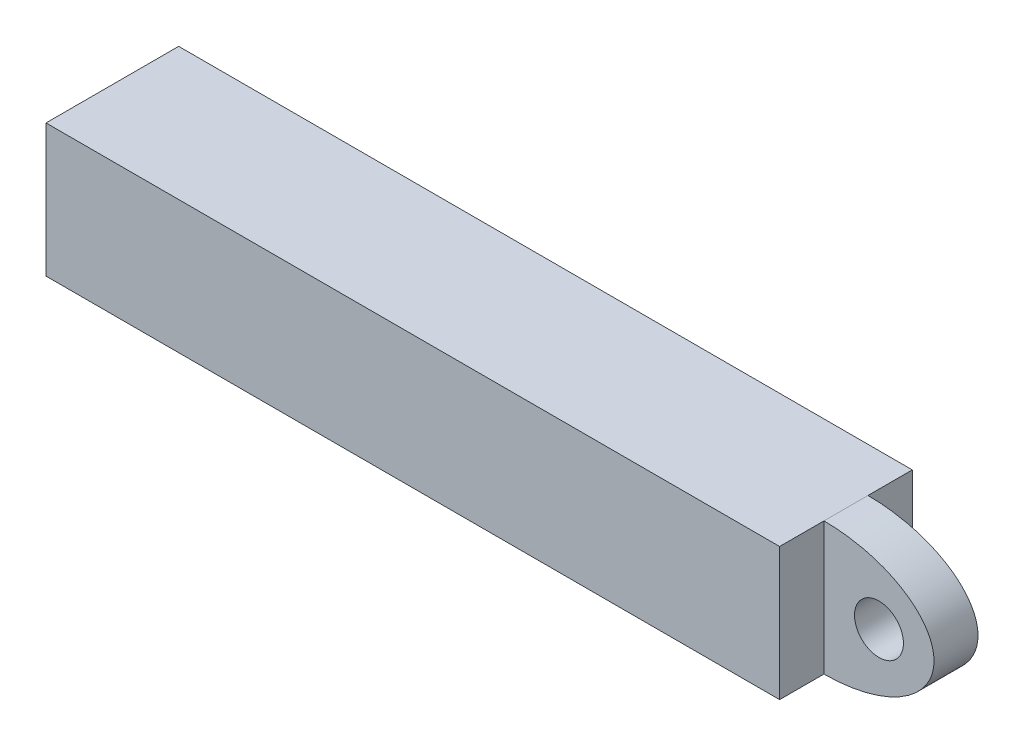
ISO-10303-21;
HEADER;
FILE_DESCRIPTION(('STEP AP214'),'2;1');
FILE_NAME('part.step','',(''),(''),'','','');
FILE_SCHEMA(('AUTOMOTIVE_DESIGN { 1 0 10303 214 1 1 1 1 }'));
ENDSEC;
DATA;
#1=APPLICATION_CONTEXT('core data for automotive mechanical design processes');
#2=APPLICATION_PROTOCOL_DEFINITION('international standard','automotive_design',2000,#1);
#3=PRODUCT_CONTEXT('',#1,'mechanical');
#4=PRODUCT('Part','Part','',(#3));
#5=PRODUCT_RELATED_PRODUCT_CATEGORY('part','',(#4));
#6=PRODUCT_DEFINITION_FORMATION('','',#4);
#7=PRODUCT_DEFINITION_CONTEXT('part definition',#1,'design');
#8=PRODUCT_DEFINITION('design','',#6,#7);
#9=PRODUCT_DEFINITION_SHAPE('','',#8);
#10=(LENGTH_UNIT() NAMED_UNIT(*) SI_UNIT(.MILLI.,.METRE.));
#11=(NAMED_UNIT(*) PLANE_ANGLE_UNIT() SI_UNIT($,.RADIAN.));
#12=(NAMED_UNIT(*) SI_UNIT($,.STERADIAN.) SOLID_ANGLE_UNIT());
#13=UNCERTAINTY_MEASURE_WITH_UNIT(LENGTH_MEASURE(1.E-05),#10,'distance_accuracy_value','');
#14=(GEOMETRIC_REPRESENTATION_CONTEXT(3) GLOBAL_UNCERTAINTY_ASSIGNED_CONTEXT((#13)) GLOBAL_UNIT_ASSIGNED_CONTEXT((#10,
#11,#12)) REPRESENTATION_CONTEXT('',''));
#15=CARTESIAN_POINT('',(0.,0.,0.));
#16=DIRECTION('',(0.,0.,1.));
#17=DIRECTION('',(1.,0.,0.));
#18=AXIS2_PLACEMENT_3D('',#15,#16,#17);
#19=CARTESIAN_POINT('',(381.,0.,0.));
#20=DIRECTION('',(1.,0.,0.));
#21=DIRECTION('',(0.,0.,-1.));
#22=AXIS2_PLACEMENT_3D('',#19,#20,#21);
#23=PLANE('',#22);
#24=DIRECTION('',(0.,0.,1.));
#25=VECTOR('',#24,1.);
#26=CARTESIAN_POINT('',(381.,34.45,-34.45));
#27=LINE('',#26,#25);
#28=CARTESIAN_POINT('',(381.,34.45,-34.45));
#29=VERTEX_POINT('',#28);
#30=CARTESIAN_POINT('',(381.,34.45,-11.43));
#31=VERTEX_POINT('',#30);
#32=EDGE_CURVE('E157',#29,#31,#27,.T.);
#33=ORIENTED_EDGE('',*,*,#32,.T.);
#34=DIRECTION('',(0.,-1.,0.));
#35=VECTOR('',#34,1.);
#36=CARTESIAN_POINT('',(381.,34.45,-11.43));
#37=LINE('',#36,#35);
#38=CARTESIAN_POINT('',(381.,-34.45,-11.43));
#39=VERTEX_POINT('',#38);
#40=EDGE_CURVE('E60',#31,#39,#37,.T.);
#41=ORIENTED_EDGE('',*,*,#40,.T.);
#42=DIRECTION('',(0.,0.,-1.));
#43=VECTOR('',#42,1.);
#44=CARTESIAN_POINT('',(381.,-34.45,-34.45));
#45=LINE('',#44,#43);
#46=CARTESIAN_POINT('',(381.,-34.45,-34.45));
#47=VERTEX_POINT('',#46);
#48=EDGE_CURVE('E105',#39,#47,#45,.T.);
#49=ORIENTED_EDGE('',*,*,#48,.T.);
#50=DIRECTION('',(0.,1.,0.));
#51=VECTOR('',#50,1.);
#52=CARTESIAN_POINT('',(381.,-34.45,-34.45));
#53=LINE('',#52,#51);
#54=EDGE_CURVE('E101',#47,#29,#53,.T.);
#55=ORIENTED_EDGE('',*,*,#54,.T.);
#56=EDGE_LOOP('',(#33,#41,#49,#55));
#57=FACE_BOUND('',#56,.T.);
#58=ADVANCED_FACE('F45',(#57),#23,.T.);
#59=CARTESIAN_POINT('',(381.,-34.45,34.45));
#60=DIRECTION('',(0.,0.,-1.));
#61=DIRECTION('',(-1.,0.,0.));
#62=AXIS2_PLACEMENT_3D('',#59,#60,#61);
#63=PLANE('',#62);
#64=DIRECTION('',(0.,-1.,0.));
#65=VECTOR('',#64,1.);
#66=CARTESIAN_POINT('',(0.,-34.45,34.45));
#67=LINE('',#66,#65);
#68=CARTESIAN_POINT('',(0.,34.45,34.45));
#69=VERTEX_POINT('',#68);
#70=CARTESIAN_POINT('',(0.,-34.45,34.45));
#71=VERTEX_POINT('',#70);
#72=EDGE_CURVE('E171',#69,#71,#67,.T.);
#73=ORIENTED_EDGE('',*,*,#72,.T.);
#74=DIRECTION('',(-1.,0.,0.));
#75=VECTOR('',#74,1.);
#76=CARTESIAN_POINT('',(381.,-34.45,34.45));
#77=LINE('',#76,#75);
#78=CARTESIAN_POINT('',(381.,-34.45,34.45));
#79=VERTEX_POINT('',#78);
#80=EDGE_CURVE('E11',#79,#71,#77,.T.);
#81=ORIENTED_EDGE('',*,*,#80,.F.);
#82=DIRECTION('',(0.,-1.,0.));
#83=VECTOR('',#82,1.);
#84=CARTESIAN_POINT('',(381.,-34.45,34.45));
#85=LINE('',#84,#83);
#86=CARTESIAN_POINT('',(381.,34.45,34.45));
#87=VERTEX_POINT('',#86);
#88=EDGE_CURVE('E98',#87,#79,#85,.T.);
#89=ORIENTED_EDGE('',*,*,#88,.F.);
#90=DIRECTION('',(-1.,0.,0.));
#91=VECTOR('',#90,1.);
#92=CARTESIAN_POINT('',(381.,34.45,34.45));
#93=LINE('',#92,#91);
#94=EDGE_CURVE('E162',#87,#69,#93,.T.);
#95=ORIENTED_EDGE('',*,*,#94,.T.);
#96=EDGE_LOOP('',(#73,#81,#89,#95));
#97=FACE_BOUND('',#96,.T.);
#98=ADVANCED_FACE('F42',(#97),#63,.F.);
#99=CARTESIAN_POINT('',(381.,-34.45,-34.45));
#100=DIRECTION('',(0.,1.,0.));
#101=DIRECTION('',(0.,0.,1.));
#102=AXIS2_PLACEMENT_3D('',#99,#100,#101);
#103=PLANE('',#102);
#104=DIRECTION('',(0.,0.,-1.));
#105=VECTOR('',#104,1.);
#106=CARTESIAN_POINT('',(0.,-34.45,-34.45));
#107=LINE('',#106,#105);
#108=CARTESIAN_POINT('',(0.,-34.45,-34.45));
#109=VERTEX_POINT('',#108);
#110=EDGE_CURVE('E178',#71,#109,#107,.T.);
#111=ORIENTED_EDGE('',*,*,#110,.T.);
#112=DIRECTION('',(-1.,0.,0.));
#113=VECTOR('',#112,1.);
#114=CARTESIAN_POINT('',(381.,-34.45,-34.45));
#115=LINE('',#114,#113);
#116=EDGE_CURVE('E49',#47,#109,#115,.T.);
#117=ORIENTED_EDGE('',*,*,#116,.F.);
#118=ORIENTED_EDGE('',*,*,#48,.F.);
#119=DIRECTION('',(0.,0.,-1.));
#120=VECTOR('',#119,1.);
#121=CARTESIAN_POINT('',(381.,-34.45,11.43));
#122=LINE('',#121,#120);
#123=CARTESIAN_POINT('',(381.,-34.45,11.43));
#124=VERTEX_POINT('',#123);
#125=EDGE_CURVE('E104',#124,#39,#122,.T.);
#126=ORIENTED_EDGE('',*,*,#125,.F.);
#127=EDGE_CURVE('E94',#79,#124,#45,.T.);
#128=ORIENTED_EDGE('',*,*,#127,.F.);
#129=ORIENTED_EDGE('',*,*,#80,.T.);
#130=EDGE_LOOP('',(#111,#117,#118,#126,#128,#129));
#131=FACE_BOUND('',#130,.T.);
#132=ADVANCED_FACE('F106',(#131),#103,.F.);
#133=CARTESIAN_POINT('',(381.,-34.45,-34.45));
#134=DIRECTION('',(0.,0.,1.));
#135=DIRECTION('',(1.,0.,0.));
#136=AXIS2_PLACEMENT_3D('',#133,#134,#135);
#137=PLANE('',#136);
#138=DIRECTION('',(0.,1.,0.));
#139=VECTOR('',#138,1.);
#140=CARTESIAN_POINT('',(0.,-34.45,-34.45));
#141=LINE('',#140,#139);
#142=CARTESIAN_POINT('',(0.,34.45,-34.45));
#143=VERTEX_POINT('',#142);
#144=EDGE_CURVE('E179',#109,#143,#141,.T.);
#145=ORIENTED_EDGE('',*,*,#144,.T.);
#146=DIRECTION('',(-1.,0.,0.));
#147=VECTOR('',#146,1.);
#148=CARTESIAN_POINT('',(381.,34.45,-34.45));
#149=LINE('',#148,#147);
#150=EDGE_CURVE('E183',#29,#143,#149,.T.);
#151=ORIENTED_EDGE('',*,*,#150,.F.);
#152=ORIENTED_EDGE('',*,*,#54,.F.);
#153=ORIENTED_EDGE('',*,*,#116,.T.);
#154=EDGE_LOOP('',(#145,#151,#152,#153));
#155=FACE_BOUND('',#154,.T.);
#156=ADVANCED_FACE('F148',(#155),#137,.F.);
#157=CARTESIAN_POINT('',(381.,34.45,-34.45));
#158=DIRECTION('',(0.,-1.,0.));
#159=DIRECTION('',(0.,0.,-1.));
#160=AXIS2_PLACEMENT_3D('',#157,#158,#159);
#161=PLANE('',#160);
#162=DIRECTION('',(0.,0.,1.));
#163=VECTOR('',#162,1.);
#164=CARTESIAN_POINT('',(0.,34.45,-34.45));
#165=LINE('',#164,#163);
#166=EDGE_CURVE('E175',#143,#69,#165,.T.);
#167=ORIENTED_EDGE('',*,*,#166,.T.);
#168=ORIENTED_EDGE('',*,*,#94,.F.);
#169=CARTESIAN_POINT('',(381.,34.45,11.43));
#170=VERTEX_POINT('',#169);
#171=EDGE_CURVE('E163',#170,#87,#27,.T.);
#172=ORIENTED_EDGE('',*,*,#171,.F.);
#173=DIRECTION('',(0.,0.,-1.));
#174=VECTOR('',#173,1.);
#175=CARTESIAN_POINT('',(381.,34.45,11.43));
#176=LINE('',#175,#174);
#177=EDGE_CURVE('E115',#170,#31,#176,.T.);
#178=ORIENTED_EDGE('',*,*,#177,.T.);
#179=ORIENTED_EDGE('',*,*,#32,.F.);
#180=ORIENTED_EDGE('',*,*,#150,.T.);
#181=EDGE_LOOP('',(#167,#168,#172,#178,#179,#180));
#182=FACE_BOUND('',#181,.T.);
#183=ADVANCED_FACE('F136',(#182),#161,.F.);
#184=DIRECTION('',(0.,-1.,0.));
#185=VECTOR('',#184,1.);
#186=CARTESIAN_POINT('',(381.,34.45,11.43));
#187=LINE('',#186,#185);
#188=EDGE_CURVE('E62',#170,#124,#187,.T.);
#189=ORIENTED_EDGE('',*,*,#188,.F.);
#190=ORIENTED_EDGE('',*,*,#171,.T.);
#191=ORIENTED_EDGE('',*,*,#88,.T.);
#192=ORIENTED_EDGE('',*,*,#127,.T.);
#193=EDGE_LOOP('',(#189,#190,#191,#192));
#194=FACE_BOUND('',#193,.T.);
#195=ADVANCED_FACE('F96',(#194),#23,.T.);
#196=CARTESIAN_POINT('',(0.,0.,0.));
#197=DIRECTION('',(1.,0.,0.));
#198=DIRECTION('',(0.,0.,-1.));
#199=AXIS2_PLACEMENT_3D('',#196,#197,#198);
#200=PLANE('',#199);
#201=ORIENTED_EDGE('',*,*,#72,.F.);
#202=ORIENTED_EDGE('',*,*,#166,.F.);
#203=ORIENTED_EDGE('',*,*,#144,.F.);
#204=ORIENTED_EDGE('',*,*,#110,.F.);
#205=EDGE_LOOP('',(#201,#202,#203,#204));
#206=FACE_BOUND('',#205,.T.);
#207=ADVANCED_FACE('F139',(#206),#200,.F.);
#208=CARTESIAN_POINT('',(381.,0.,11.43));
#209=DIRECTION('',(0.,0.,1.));
#210=DIRECTION('',(1.,0.,0.));
#211=AXIS2_PLACEMENT_3D('',#208,#209,#210);
#212=PLANE('',#211);
#213=CARTESIAN_POINT('',(381.,0.,11.43));
#214=DIRECTION('',(0.,0.,1.));
#215=DIRECTION('',(-1.,0.,0.));
#216=AXIS2_PLACEMENT_3D('',#213,#214,#215);
#217=ELLIPSE('',#216,57.15,34.45);
#218=EDGE_CURVE('E120',#124,#170,#217,.T.);
#219=ORIENTED_EDGE('',*,*,#218,.T.);
#220=ORIENTED_EDGE('',*,*,#188,.T.);
#221=EDGE_LOOP('',(#219,#220));
#222=FACE_BOUND('',#221,.T.);
#223=CARTESIAN_POINT('',(409.575,0.,11.43));
#224=DIRECTION('',(0.,0.,1.));
#225=DIRECTION('',(1.,0.,0.));
#226=AXIS2_PLACEMENT_3D('',#223,#224,#225);
#227=CIRCLE('',#226,12.7);
#228=CARTESIAN_POINT('',(422.275,0.,11.43));
#229=VERTEX_POINT('',#228);
#230=EDGE_CURVE('E169',#229,#229,#227,.T.);
#231=ORIENTED_EDGE('',*,*,#230,.F.);
#232=EDGE_LOOP('',(#231));
#233=FACE_BOUND('',#232,.T.);
#234=ADVANCED_FACE('F119',(#222,#233),#212,.T.);
#235=CARTESIAN_POINT('',(381.,0.,-11.43));
#236=DIRECTION('',(0.,0.,1.));
#237=DIRECTION('',(1.,0.,0.));
#238=AXIS2_PLACEMENT_3D('',#235,#236,#237);
#239=PLANE('',#238);
#240=CARTESIAN_POINT('',(381.,0.,-11.43));
#241=DIRECTION('',(0.,0.,1.));
#242=DIRECTION('',(-1.,0.,0.));
#243=AXIS2_PLACEMENT_3D('',#240,#241,#242);
#244=ELLIPSE('',#243,57.15,34.45);
#245=EDGE_CURVE('E123',#39,#31,#244,.T.);
#246=ORIENTED_EDGE('',*,*,#245,.F.);
#247=ORIENTED_EDGE('',*,*,#40,.F.);
#248=EDGE_LOOP('',(#246,#247));
#249=FACE_BOUND('',#248,.T.);
#250=CARTESIAN_POINT('',(409.575,0.,-11.43));
#251=DIRECTION('',(0.,0.,1.));
#252=DIRECTION('',(1.,0.,0.));
#253=AXIS2_PLACEMENT_3D('',#250,#251,#252);
#254=CIRCLE('',#253,12.7);
#255=CARTESIAN_POINT('',(422.275,0.,-11.43));
#256=VERTEX_POINT('',#255);
#257=EDGE_CURVE('E130',#256,#256,#254,.T.);
#258=ORIENTED_EDGE('',*,*,#257,.T.);
#259=EDGE_LOOP('',(#258));
#260=FACE_BOUND('',#259,.T.);
#261=ADVANCED_FACE('F133',(#249,#260),#239,.F.);
#262=DIRECTION('',(0.,0.,-1.));
#263=VECTOR('',#262,1.);
#264=SURFACE_OF_LINEAR_EXTRUSION('',#217,#263);
#265=ORIENTED_EDGE('',*,*,#245,.T.);
#266=ORIENTED_EDGE('',*,*,#177,.F.);
#267=ORIENTED_EDGE('',*,*,#218,.F.);
#268=ORIENTED_EDGE('',*,*,#125,.T.);
#269=EDGE_LOOP('',(#265,#266,#267,#268));
#270=FACE_BOUND('',#269,.T.);
#271=ADVANCED_FACE('F121',(#270),#264,.F.);
#272=CARTESIAN_POINT('',(409.575,0.,11.43));
#273=DIRECTION('',(0.,0.,-1.));
#274=DIRECTION('',(-1.,0.,0.));
#275=AXIS2_PLACEMENT_3D('',#272,#273,#274);
#276=CYLINDRICAL_SURFACE('',#275,12.7);
#277=ORIENTED_EDGE('',*,*,#230,.T.);
#278=EDGE_LOOP('',(#277));
#279=FACE_BOUND('',#278,.T.);
#280=ORIENTED_EDGE('',*,*,#257,.F.);
#281=EDGE_LOOP('',(#280));
#282=FACE_BOUND('',#281,.T.);
#283=ADVANCED_FACE('F131',(#279,#282),#276,.F.);
#284=CLOSED_SHELL('',(#58,#98,#132,#156,#183,#195,#207,#234,#261,#271,#283));
#285=MANIFOLD_SOLID_BREP('B2',#284);
#286=ADVANCED_BREP_SHAPE_REPRESENTATION('',(#18,#285),#14);
#287=SHAPE_DEFINITION_REPRESENTATION(#9,#286);
ENDSEC;
END-ISO-10303-21;
